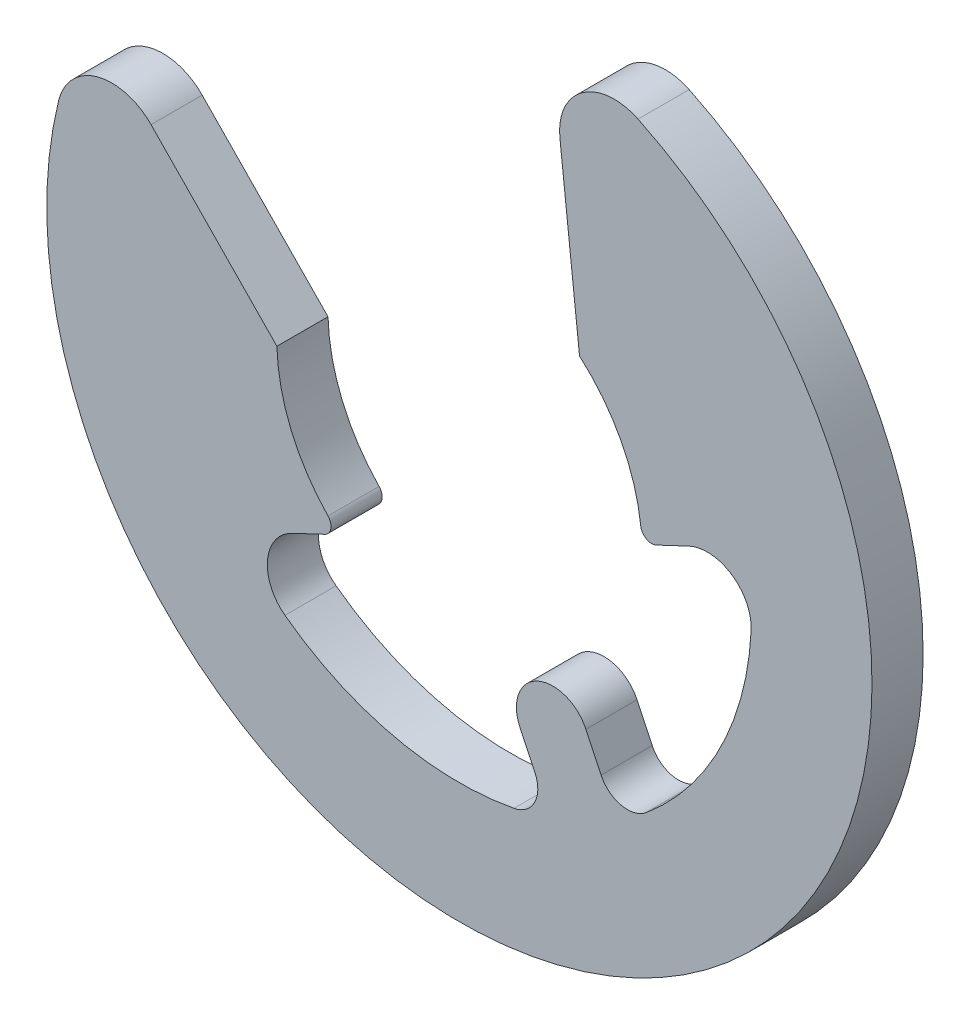
ISO-10303-21;
HEADER;
FILE_DESCRIPTION(('STEP AP214'),'2;1');
FILE_NAME('part.step','',(''),(''),'','','');
FILE_SCHEMA(('AUTOMOTIVE_DESIGN { 1 0 10303 214 1 1 1 1 }'));
ENDSEC;
DATA;
#1=APPLICATION_CONTEXT('core data for automotive mechanical design processes');
#2=APPLICATION_PROTOCOL_DEFINITION('international standard','automotive_design',2000,#1);
#3=PRODUCT_CONTEXT('',#1,'mechanical');
#4=PRODUCT('Part','Part','',(#3));
#5=PRODUCT_RELATED_PRODUCT_CATEGORY('part','',(#4));
#6=PRODUCT_DEFINITION_FORMATION('','',#4);
#7=PRODUCT_DEFINITION_CONTEXT('part definition',#1,'design');
#8=PRODUCT_DEFINITION('design','',#6,#7);
#9=PRODUCT_DEFINITION_SHAPE('','',#8);
#10=(LENGTH_UNIT() NAMED_UNIT(*) SI_UNIT(.MILLI.,.METRE.));
#11=(NAMED_UNIT(*) PLANE_ANGLE_UNIT() SI_UNIT($,.RADIAN.));
#12=(NAMED_UNIT(*) SI_UNIT($,.STERADIAN.) SOLID_ANGLE_UNIT());
#13=UNCERTAINTY_MEASURE_WITH_UNIT(LENGTH_MEASURE(1.E-05),#10,'distance_accuracy_value','');
#14=(GEOMETRIC_REPRESENTATION_CONTEXT(3) GLOBAL_UNCERTAINTY_ASSIGNED_CONTEXT((#13)) GLOBAL_UNIT_ASSIGNED_CONTEXT((#10,
#11,#12)) REPRESENTATION_CONTEXT('',''));
#15=CARTESIAN_POINT('',(0.,0.,0.));
#16=DIRECTION('',(0.,0.,1.));
#17=DIRECTION('',(1.,0.,0.));
#18=AXIS2_PLACEMENT_3D('',#15,#16,#17);
#19=CARTESIAN_POINT('',(0.512266617917888,5.9146422259787,-18.3));
#20=DIRECTION('',(0.,0.,1.));
#21=DIRECTION('',(0.,-1.,0.));
#22=AXIS2_PLACEMENT_3D('',#19,#20,#21);
#23=PLANE('',#22);
#24=CARTESIAN_POINT('',(0.,7.,-18.3));
#25=DIRECTION('',(0.,0.,1.));
#26=DIRECTION('',(1.,0.,0.));
#27=AXIS2_PLACEMENT_3D('',#24,#25,#26);
#28=CIRCLE('',#27,2.5);
#29=CARTESIAN_POINT('',(-1.7991094183781,5.26414133619606,-18.3));
#30=VERTEX_POINT('',#29);
#31=CARTESIAN_POINT('',(-2.49891490841319,6.92635028506309,-18.3));
#32=VERTEX_POINT('',#31);
#33=EDGE_CURVE('E175',#30,#32,#28,.F.);
#34=ORIENTED_EDGE('',*,*,#33,.T.);
#35=DIRECTION('',(-0.698140103515913,0.715961169242292,0.));
#36=VECTOR('',#35,1.);
#37=CARTESIAN_POINT('',(-4.22147382335914,8.69288008133531,-18.3));
#38=LINE('',#37,#36);
#39=CARTESIAN_POINT('',(-4.22147382335914,8.69288008133531,-18.3));
#40=VERTEX_POINT('',#39);
#41=EDGE_CURVE('E156',#40,#32,#38,.F.);
#42=ORIENTED_EDGE('',*,*,#41,.F.);
#43=CARTESIAN_POINT('',(-4.75844470029086,8.16927500369837,-18.3));
#44=DIRECTION('',(0.,0.,1.));
#45=DIRECTION('',(1.,0.,0.));
#46=AXIS2_PLACEMENT_3D('',#43,#44,#45);
#47=CIRCLE('',#46,0.750000000000001);
#48=CARTESIAN_POINT('',(-5.48677807278436,8.34824566752975,-18.3));
#49=VERTEX_POINT('',#48);
#50=EDGE_CURVE('E19',#40,#49,#47,.T.);
#51=ORIENTED_EDGE('',*,*,#50,.T.);
#52=CARTESIAN_POINT('',(0.,7.,-18.3));
#53=DIRECTION('',(0.,0.,1.));
#54=DIRECTION('',(1.,0.,0.));
#55=AXIS2_PLACEMENT_3D('',#52,#53,#54);
#56=CIRCLE('',#55,5.65);
#57=CARTESIAN_POINT('',(2.44677442311725,12.0927197961776,-18.3));
#58=VERTEX_POINT('',#57);
#59=EDGE_CURVE('E154',#58,#49,#56,.F.);
#60=ORIENTED_EDGE('',*,*,#59,.F.);
#61=CARTESIAN_POINT('',(2.12198135810169,11.4166950444726,-18.3));
#62=DIRECTION('',(0.,0.,1.));
#63=DIRECTION('',(1.,0.,0.));
#64=AXIS2_PLACEMENT_3D('',#61,#62,#63);
#65=CIRCLE('',#64,0.750000000000001);
#66=CARTESIAN_POINT('',(1.37644584133832,11.3349833975404,-18.3));
#67=VERTEX_POINT('',#66);
#68=EDGE_CURVE('E163',#67,#58,#65,.F.);
#69=ORIENTED_EDGE('',*,*,#68,.F.);
#70=DIRECTION('',(0.108948862576308,-0.994047355684491,0.));
#71=VECTOR('',#70,1.);
#72=CARTESIAN_POINT('',(1.64526127474332,8.88231648184624,-18.3));
#73=LINE('',#72,#71);
#74=CARTESIAN_POINT('',(1.64526127474332,8.88231648184623,-18.3));
#75=VERTEX_POINT('',#74);
#76=EDGE_CURVE('E227',#75,#67,#73,.F.);
#77=ORIENTED_EDGE('',*,*,#76,.F.);
#78=CARTESIAN_POINT('',(0.,7.,-18.3));
#79=DIRECTION('',(0.,0.,1.));
#80=DIRECTION('',(1.,0.,0.));
#81=AXIS2_PLACEMENT_3D('',#78,#79,#80);
#82=CIRCLE('',#81,2.5);
#83=CARTESIAN_POINT('',(2.48364299254734,7.285512671471,-18.3));
#84=VERTEX_POINT('',#83);
#85=EDGE_CURVE('E224',#75,#84,#82,.F.);
#86=ORIENTED_EDGE('',*,*,#85,.T.);
#87=CARTESIAN_POINT('',(2.63266157210018,7.30264343175926,-18.3));
#88=DIRECTION('',(0.,0.,1.));
#89=DIRECTION('',(1.,0.,0.));
#90=AXIS2_PLACEMENT_3D('',#87,#88,#89);
#91=CIRCLE('',#90,0.15);
#92=CARTESIAN_POINT('',(2.69668559462542,7.16699342424106,-18.3));
#93=VERTEX_POINT('',#92);
#94=EDGE_CURVE('E220',#93,#84,#91,.F.);
#95=ORIENTED_EDGE('',*,*,#94,.F.);
#96=DIRECTION('',(0.904333383454662,0.426826816834936,0.));
#97=VECTOR('',#96,1.);
#98=CARTESIAN_POINT('',(3.13982696719892,7.37614706705015,-18.3));
#99=LINE('',#98,#97);
#100=CARTESIAN_POINT('',(3.13982696719892,7.37614706705015,-18.3));
#101=VERTEX_POINT('',#100);
#102=EDGE_CURVE('E217',#101,#93,#99,.F.);
#103=ORIENTED_EDGE('',*,*,#102,.F.);
#104=CARTESIAN_POINT('',(3.39592305729988,6.83354703697735,-18.3));
#105=DIRECTION('',(0.,0.,1.));
#106=DIRECTION('',(1.,0.,0.));
#107=AXIS2_PLACEMENT_3D('',#104,#105,#106);
#108=CIRCLE('',#107,0.6);
#109=CARTESIAN_POINT('',(3.99520359682339,6.80417298467924,-18.3));
#110=VERTEX_POINT('',#109);
#111=EDGE_CURVE('E214',#101,#110,#108,.F.);
#112=ORIENTED_EDGE('',*,*,#111,.T.);
#113=CARTESIAN_POINT('',(0.,7.,-18.3));
#114=DIRECTION('',(0.,0.,1.));
#115=DIRECTION('',(1.,0.,0.));
#116=AXIS2_PLACEMENT_3D('',#113,#114,#115);
#117=CIRCLE('',#116,4.);
#118=CARTESIAN_POINT('',(2.55742653677109,3.92435868329562,-18.3));
#119=VERTEX_POINT('',#118);
#120=EDGE_CURVE('E210',#110,#119,#117,.F.);
#121=ORIENTED_EDGE('',*,*,#120,.T.);
#122=CARTESIAN_POINT('',(2.30168388309398,4.23192281496606,-18.3));
#123=DIRECTION('',(0.,0.,1.));
#124=DIRECTION('',(1.,0.,0.));
#125=AXIS2_PLACEMENT_3D('',#122,#123,#124);
#126=CIRCLE('',#125,0.4);
#127=CARTESIAN_POINT('',(1.93995052971212,4.06119208823209,-18.3));
#128=VERTEX_POINT('',#127);
#129=EDGE_CURVE('E206',#119,#128,#126,.F.);
#130=ORIENTED_EDGE('',*,*,#129,.T.);
#131=DIRECTION('',(-0.426826816834936,0.904333383454662,0.));
#132=VECTOR('',#131,1.);
#133=CARTESIAN_POINT('',(1.73264714223214,4.50041325805348,-18.3));
#134=LINE('',#133,#132);
#135=CARTESIAN_POINT('',(1.73264714223214,4.50041325805349,-18.3));
#136=VERTEX_POINT('',#135);
#137=EDGE_CURVE('E202',#136,#128,#134,.F.);
#138=ORIENTED_EDGE('',*,*,#137,.F.);
#139=CARTESIAN_POINT('',(1.28048045050481,4.28699984963602,-18.3));
#140=DIRECTION('',(0.,0.,1.));
#141=DIRECTION('',(1.,0.,0.));
#142=AXIS2_PLACEMENT_3D('',#139,#140,#141);
#143=CIRCLE('',#142,0.5);
#144=CARTESIAN_POINT('',(0.828313758777477,4.07358644121855,-18.3));
#145=VERTEX_POINT('',#144);
#146=EDGE_CURVE('E199',#145,#136,#143,.F.);
#147=ORIENTED_EDGE('',*,*,#146,.F.);
#148=DIRECTION('',(0.426826816834936,-0.904333383454662,0.));
#149=VECTOR('',#148,1.);
#150=CARTESIAN_POINT('',(1.03561714625746,3.63436527139715,-18.3));
#151=LINE('',#150,#149);
#152=CARTESIAN_POINT('',(1.03561714625746,3.63436527139715,-18.3));
#153=VERTEX_POINT('',#152);
#154=EDGE_CURVE('E196',#153,#145,#151,.F.);
#155=ORIENTED_EDGE('',*,*,#154,.F.);
#156=CARTESIAN_POINT('',(0.673883792875592,3.46363454466318,-18.3));
#157=DIRECTION('',(0.,0.,1.));
#158=DIRECTION('',(1.,0.,0.));
#159=AXIS2_PLACEMENT_3D('',#156,#157,#158);
#160=CIRCLE('',#159,0.4);
#161=CARTESIAN_POINT('',(0.748759769861767,3.07070504962575,-18.3));
#162=VERTEX_POINT('',#161);
#163=EDGE_CURVE('E193',#153,#162,#160,.F.);
#164=ORIENTED_EDGE('',*,*,#163,.T.);
#165=CARTESIAN_POINT('',(0.,7.,-18.3));
#166=DIRECTION('',(0.,0.,1.));
#167=DIRECTION('',(1.,0.,0.));
#168=AXIS2_PLACEMENT_3D('',#165,#166,#167);
#169=CIRCLE('',#168,4.);
#170=CARTESIAN_POINT('',(-2.38832616873893,3.79127780702086,-18.3));
#171=VERTEX_POINT('',#170);
#172=EDGE_CURVE('E189',#162,#171,#169,.F.);
#173=ORIENTED_EDGE('',*,*,#172,.T.);
#174=CARTESIAN_POINT('',(-2.03007724342809,4.27258613596773,-18.3));
#175=DIRECTION('',(0.,0.,1.));
#176=DIRECTION('',(1.,0.,0.));
#177=AXIS2_PLACEMENT_3D('',#174,#175,#176);
#178=CIRCLE('',#177,0.6);
#179=CARTESIAN_POINT('',(-2.28617333352905,4.81518616604053,-18.3));
#180=VERTEX_POINT('',#179);
#181=EDGE_CURVE('E185',#171,#180,#178,.F.);
#182=ORIENTED_EDGE('',*,*,#181,.T.);
#183=DIRECTION('',(0.904333383454662,0.426826816834936,0.));
#184=VECTOR('',#183,1.);
#185=CARTESIAN_POINT('',(-1.84303196095555,5.02433980884962,-18.3));
#186=LINE('',#185,#184);
#187=CARTESIAN_POINT('',(-1.84303196095555,5.02433980884962,-18.3));
#188=VERTEX_POINT('',#187);
#189=EDGE_CURVE('E181',#188,#180,#186,.F.);
#190=ORIENTED_EDGE('',*,*,#189,.F.);
#191=CARTESIAN_POINT('',(-1.90705598348079,5.15998981636782,-18.3));
#192=DIRECTION('',(0.,0.,1.));
#193=DIRECTION('',(1.,0.,0.));
#194=AXIS2_PLACEMENT_3D('',#191,#192,#193);
#195=CIRCLE('',#194,0.15);
#196=EDGE_CURVE('E178',#30,#188,#195,.F.);
#197=ORIENTED_EDGE('',*,*,#196,.F.);
#198=EDGE_LOOP('',(#34,#42,#51,#60,#69,#77,#86,#95,#103,#112,#121,#130,#138,#147,#155,#164,#173,
#182,#190,#197));
#199=FACE_BOUND('',#198,.T.);
#200=ADVANCED_FACE('F16',(#199),#23,.T.);
#201=CARTESIAN_POINT('',(0.,7.,-19.));
#202=DIRECTION('',(0.,0.,1.));
#203=DIRECTION('',(1.,0.,0.));
#204=AXIS2_PLACEMENT_3D('',#201,#202,#203);
#205=CYLINDRICAL_SURFACE('',#204,5.65);
#206=DIRECTION('',(0.,0.,1.));
#207=VECTOR('',#206,1.);
#208=CARTESIAN_POINT('',(2.44677442311725,12.0927197961776,-19.));
#209=LINE('',#208,#207);
#210=CARTESIAN_POINT('',(2.44677442311725,12.0927197961776,-19.));
#211=VERTEX_POINT('',#210);
#212=EDGE_CURVE('E162',#58,#211,#209,.F.);
#213=ORIENTED_EDGE('',*,*,#212,.F.);
#214=ORIENTED_EDGE('',*,*,#59,.T.);
#215=DIRECTION('',(0.,0.,1.));
#216=VECTOR('',#215,1.);
#217=CARTESIAN_POINT('',(-5.48677807278436,8.34824566752976,-19.));
#218=LINE('',#217,#216);
#219=CARTESIAN_POINT('',(-5.48677807278436,8.34824566752975,-19.));
#220=VERTEX_POINT('',#219);
#221=EDGE_CURVE('E161',#220,#49,#218,.T.);
#222=ORIENTED_EDGE('',*,*,#221,.F.);
#223=CARTESIAN_POINT('',(0.,7.,-19.));
#224=DIRECTION('',(0.,0.,1.));
#225=DIRECTION('',(1.,0.,0.));
#226=AXIS2_PLACEMENT_3D('',#223,#224,#225);
#227=CIRCLE('',#226,5.65);
#228=EDGE_CURVE('E167',#220,#211,#227,.T.);
#229=ORIENTED_EDGE('',*,*,#228,.T.);
#230=EDGE_LOOP('',(#213,#214,#222,#229));
#231=FACE_BOUND('',#230,.T.);
#232=ADVANCED_FACE('F159',(#231),#205,.T.);
#233=CARTESIAN_POINT('',(2.12198135810169,11.4166950444726,-19.));
#234=DIRECTION('',(0.,0.,1.));
#235=DIRECTION('',(1.,0.,0.));
#236=AXIS2_PLACEMENT_3D('',#233,#234,#235);
#237=CYLINDRICAL_SURFACE('',#236,0.750000000000001);
#238=ORIENTED_EDGE('',*,*,#68,.T.);
#239=ORIENTED_EDGE('',*,*,#212,.T.);
#240=CARTESIAN_POINT('',(2.12198135810169,11.4166950444726,-19.));
#241=DIRECTION('',(0.,0.,1.));
#242=DIRECTION('',(1.,0.,0.));
#243=AXIS2_PLACEMENT_3D('',#240,#241,#242);
#244=CIRCLE('',#243,0.750000000000001);
#245=CARTESIAN_POINT('',(1.37644584133832,11.3349833975404,-19.));
#246=VERTEX_POINT('',#245);
#247=EDGE_CURVE('E273',#211,#246,#244,.T.);
#248=ORIENTED_EDGE('',*,*,#247,.T.);
#249=DIRECTION('',(0.,0.,1.));
#250=VECTOR('',#249,1.);
#251=CARTESIAN_POINT('',(1.37644584133832,11.3349833975404,-19.));
#252=LINE('',#251,#250);
#253=EDGE_CURVE('E225',#67,#246,#252,.F.);
#254=ORIENTED_EDGE('',*,*,#253,.F.);
#255=EDGE_LOOP('',(#238,#239,#248,#254));
#256=FACE_BOUND('',#255,.T.);
#257=ADVANCED_FACE('F297',(#256),#237,.T.);
#258=CARTESIAN_POINT('',(1.64526127474332,8.88231648184624,-19.));
#259=DIRECTION('',(-0.994047355684491,-0.108948862576308,0.));
#260=DIRECTION('',(0.108948862576308,-0.994047355684491,0.));
#261=AXIS2_PLACEMENT_3D('',#258,#259,#260);
#262=PLANE('',#261);
#263=ORIENTED_EDGE('',*,*,#76,.T.);
#264=ORIENTED_EDGE('',*,*,#253,.T.);
#265=DIRECTION('',(0.108948862576307,-0.994047355684491,0.));
#266=VECTOR('',#265,1.);
#267=CARTESIAN_POINT('',(1.37644584133832,11.3349833975404,-19.));
#268=LINE('',#267,#266);
#269=CARTESIAN_POINT('',(1.64526127474332,8.88231648184624,-19.));
#270=VERTEX_POINT('',#269);
#271=EDGE_CURVE('E272',#246,#270,#268,.T.);
#272=ORIENTED_EDGE('',*,*,#271,.T.);
#273=DIRECTION('',(0.,0.,1.));
#274=VECTOR('',#273,1.);
#275=CARTESIAN_POINT('',(1.64526127474332,8.88231648184624,-19.));
#276=LINE('',#275,#274);
#277=EDGE_CURVE('E221',#270,#75,#276,.T.);
#278=ORIENTED_EDGE('',*,*,#277,.T.);
#279=EDGE_LOOP('',(#263,#264,#272,#278));
#280=FACE_BOUND('',#279,.T.);
#281=ADVANCED_FACE('F304',(#280),#262,.T.);
#282=CARTESIAN_POINT('',(0.,7.,-19.));
#283=DIRECTION('',(0.,0.,1.));
#284=DIRECTION('',(1.,0.,0.));
#285=AXIS2_PLACEMENT_3D('',#282,#283,#284);
#286=CYLINDRICAL_SURFACE('',#285,2.5);
#287=CARTESIAN_POINT('',(0.,7.,-19.));
#288=DIRECTION('',(0.,0.,1.));
#289=DIRECTION('',(1.,0.,0.));
#290=AXIS2_PLACEMENT_3D('',#287,#288,#289);
#291=CIRCLE('',#290,2.5);
#292=CARTESIAN_POINT('',(2.48364299254734,7.285512671471,-19.));
#293=VERTEX_POINT('',#292);
#294=EDGE_CURVE('E269',#270,#293,#291,.F.);
#295=ORIENTED_EDGE('',*,*,#294,.T.);
#296=DIRECTION('',(0.,0.,1.));
#297=VECTOR('',#296,1.);
#298=CARTESIAN_POINT('',(2.48364299254734,7.285512671471,-19.));
#299=LINE('',#298,#297);
#300=EDGE_CURVE('E218',#84,#293,#299,.F.);
#301=ORIENTED_EDGE('',*,*,#300,.F.);
#302=ORIENTED_EDGE('',*,*,#85,.F.);
#303=ORIENTED_EDGE('',*,*,#277,.F.);
#304=EDGE_LOOP('',(#295,#301,#302,#303));
#305=FACE_BOUND('',#304,.T.);
#306=ADVANCED_FACE('F308',(#305),#286,.F.);
#307=CARTESIAN_POINT('',(2.63266157210018,7.30264343175926,-19.));
#308=DIRECTION('',(0.,0.,1.));
#309=DIRECTION('',(1.,0.,0.));
#310=AXIS2_PLACEMENT_3D('',#307,#308,#309);
#311=CYLINDRICAL_SURFACE('',#310,0.15);
#312=ORIENTED_EDGE('',*,*,#94,.T.);
#313=ORIENTED_EDGE('',*,*,#300,.T.);
#314=CARTESIAN_POINT('',(2.63266157210018,7.30264343175926,-19.));
#315=DIRECTION('',(0.,0.,1.));
#316=DIRECTION('',(1.,0.,0.));
#317=AXIS2_PLACEMENT_3D('',#314,#315,#316);
#318=CIRCLE('',#317,0.15);
#319=CARTESIAN_POINT('',(2.69668559462542,7.16699342424106,-19.));
#320=VERTEX_POINT('',#319);
#321=EDGE_CURVE('E266',#293,#320,#318,.T.);
#322=ORIENTED_EDGE('',*,*,#321,.T.);
#323=DIRECTION('',(0.,0.,1.));
#324=VECTOR('',#323,1.);
#325=CARTESIAN_POINT('',(2.69668559462542,7.16699342424106,-19.));
#326=LINE('',#325,#324);
#327=EDGE_CURVE('E215',#93,#320,#326,.F.);
#328=ORIENTED_EDGE('',*,*,#327,.F.);
#329=EDGE_LOOP('',(#312,#313,#322,#328));
#330=FACE_BOUND('',#329,.T.);
#331=ADVANCED_FACE('F318',(#330),#311,.T.);
#332=CARTESIAN_POINT('',(3.13982696719892,7.37614706705015,-19.));
#333=DIRECTION('',(0.426826816834936,-0.904333383454662,0.));
#334=DIRECTION('',(0.904333383454662,0.426826816834936,0.));
#335=AXIS2_PLACEMENT_3D('',#332,#333,#334);
#336=PLANE('',#335);
#337=ORIENTED_EDGE('',*,*,#102,.T.);
#338=ORIENTED_EDGE('',*,*,#327,.T.);
#339=DIRECTION('',(0.904333383454664,0.426826816834932,0.));
#340=VECTOR('',#339,1.);
#341=CARTESIAN_POINT('',(2.69668559462542,7.16699342424106,-19.));
#342=LINE('',#341,#340);
#343=CARTESIAN_POINT('',(3.13982696719892,7.37614706705015,-19.));
#344=VERTEX_POINT('',#343);
#345=EDGE_CURVE('E265',#320,#344,#342,.T.);
#346=ORIENTED_EDGE('',*,*,#345,.T.);
#347=DIRECTION('',(0.,0.,1.));
#348=VECTOR('',#347,1.);
#349=CARTESIAN_POINT('',(3.13982696719892,7.37614706705015,-19.));
#350=LINE('',#349,#348);
#351=EDGE_CURVE('E211',#344,#101,#350,.T.);
#352=ORIENTED_EDGE('',*,*,#351,.T.);
#353=EDGE_LOOP('',(#337,#338,#346,#352));
#354=FACE_BOUND('',#353,.T.);
#355=ADVANCED_FACE('F321',(#354),#336,.T.);
#356=CARTESIAN_POINT('',(3.39592305729988,6.83354703697735,-19.));
#357=DIRECTION('',(0.,0.,1.));
#358=DIRECTION('',(1.,0.,0.));
#359=AXIS2_PLACEMENT_3D('',#356,#357,#358);
#360=CYLINDRICAL_SURFACE('',#359,0.6);
#361=CARTESIAN_POINT('',(3.39592305729988,6.83354703697735,-19.));
#362=DIRECTION('',(0.,0.,1.));
#363=DIRECTION('',(1.,0.,0.));
#364=AXIS2_PLACEMENT_3D('',#361,#362,#363);
#365=CIRCLE('',#364,0.6);
#366=CARTESIAN_POINT('',(3.99520359682339,6.80417298467924,-19.));
#367=VERTEX_POINT('',#366);
#368=EDGE_CURVE('E262',#344,#367,#365,.F.);
#369=ORIENTED_EDGE('',*,*,#368,.T.);
#370=DIRECTION('',(0.,0.,1.));
#371=VECTOR('',#370,1.);
#372=CARTESIAN_POINT('',(3.99520359682339,6.80417298467924,-19.));
#373=LINE('',#372,#371);
#374=EDGE_CURVE('E207',#367,#110,#373,.T.);
#375=ORIENTED_EDGE('',*,*,#374,.T.);
#376=ORIENTED_EDGE('',*,*,#111,.F.);
#377=ORIENTED_EDGE('',*,*,#351,.F.);
#378=EDGE_LOOP('',(#369,#375,#376,#377));
#379=FACE_BOUND('',#378,.T.);
#380=ADVANCED_FACE('F323',(#379),#360,.F.);
#381=CARTESIAN_POINT('',(0.,7.,-19.));
#382=DIRECTION('',(0.,0.,1.));
#383=DIRECTION('',(1.,0.,0.));
#384=AXIS2_PLACEMENT_3D('',#381,#382,#383);
#385=CYLINDRICAL_SURFACE('',#384,4.);
#386=CARTESIAN_POINT('',(0.,7.,-19.));
#387=DIRECTION('',(0.,0.,1.));
#388=DIRECTION('',(1.,0.,0.));
#389=AXIS2_PLACEMENT_3D('',#386,#387,#388);
#390=CIRCLE('',#389,4.);
#391=CARTESIAN_POINT('',(2.55742653677109,3.92435868329562,-19.));
#392=VERTEX_POINT('',#391);
#393=EDGE_CURVE('E259',#367,#392,#390,.F.);
#394=ORIENTED_EDGE('',*,*,#393,.T.);
#395=DIRECTION('',(0.,0.,1.));
#396=VECTOR('',#395,1.);
#397=CARTESIAN_POINT('',(2.55742653677109,3.92435868329562,-19.));
#398=LINE('',#397,#396);
#399=EDGE_CURVE('E203',#392,#119,#398,.T.);
#400=ORIENTED_EDGE('',*,*,#399,.T.);
#401=ORIENTED_EDGE('',*,*,#120,.F.);
#402=ORIENTED_EDGE('',*,*,#374,.F.);
#403=EDGE_LOOP('',(#394,#400,#401,#402));
#404=FACE_BOUND('',#403,.T.);
#405=ADVANCED_FACE('F328',(#404),#385,.F.);
#406=CARTESIAN_POINT('',(2.30168388309398,4.23192281496606,-19.));
#407=DIRECTION('',(0.,0.,1.));
#408=DIRECTION('',(1.,0.,0.));
#409=AXIS2_PLACEMENT_3D('',#406,#407,#408);
#410=CYLINDRICAL_SURFACE('',#409,0.4);
#411=CARTESIAN_POINT('',(2.30168388309398,4.23192281496606,-19.));
#412=DIRECTION('',(0.,0.,1.));
#413=DIRECTION('',(1.,0.,0.));
#414=AXIS2_PLACEMENT_3D('',#411,#412,#413);
#415=CIRCLE('',#414,0.4);
#416=CARTESIAN_POINT('',(1.93995052971212,4.06119208823209,-19.));
#417=VERTEX_POINT('',#416);
#418=EDGE_CURVE('E256',#392,#417,#415,.F.);
#419=ORIENTED_EDGE('',*,*,#418,.T.);
#420=DIRECTION('',(0.,0.,1.));
#421=VECTOR('',#420,1.);
#422=CARTESIAN_POINT('',(1.93995052971212,4.06119208823209,-19.));
#423=LINE('',#422,#421);
#424=EDGE_CURVE('E200',#128,#417,#423,.F.);
#425=ORIENTED_EDGE('',*,*,#424,.F.);
#426=ORIENTED_EDGE('',*,*,#129,.F.);
#427=ORIENTED_EDGE('',*,*,#399,.F.);
#428=EDGE_LOOP('',(#419,#425,#426,#427));
#429=FACE_BOUND('',#428,.T.);
#430=ADVANCED_FACE('F334',(#429),#410,.F.);
#431=CARTESIAN_POINT('',(1.73264714223214,4.50041325805348,-19.));
#432=DIRECTION('',(0.904333383454662,0.426826816834936,0.));
#433=DIRECTION('',(-0.426826816834936,0.904333383454662,0.));
#434=AXIS2_PLACEMENT_3D('',#431,#432,#433);
#435=PLANE('',#434);
#436=ORIENTED_EDGE('',*,*,#137,.T.);
#437=ORIENTED_EDGE('',*,*,#424,.T.);
#438=DIRECTION('',(-0.426826816834935,0.904333383454662,0.));
#439=VECTOR('',#438,1.);
#440=CARTESIAN_POINT('',(1.93995052971212,4.06119208823209,-19.));
#441=LINE('',#440,#439);
#442=CARTESIAN_POINT('',(1.73264714223214,4.50041325805349,-19.));
#443=VERTEX_POINT('',#442);
#444=EDGE_CURVE('E255',#417,#443,#441,.T.);
#445=ORIENTED_EDGE('',*,*,#444,.T.);
#446=DIRECTION('',(0.,0.,1.));
#447=VECTOR('',#446,1.);
#448=CARTESIAN_POINT('',(1.73264714223214,4.50041325805349,-19.));
#449=LINE('',#448,#447);
#450=EDGE_CURVE('E197',#136,#443,#449,.F.);
#451=ORIENTED_EDGE('',*,*,#450,.F.);
#452=EDGE_LOOP('',(#436,#437,#445,#451));
#453=FACE_BOUND('',#452,.T.);
#454=ADVANCED_FACE('F337',(#453),#435,.T.);
#455=CARTESIAN_POINT('',(1.28048045050481,4.28699984963602,-19.));
#456=DIRECTION('',(0.,0.,1.));
#457=DIRECTION('',(1.,0.,0.));
#458=AXIS2_PLACEMENT_3D('',#455,#456,#457);
#459=CYLINDRICAL_SURFACE('',#458,0.5);
#460=ORIENTED_EDGE('',*,*,#146,.T.);
#461=ORIENTED_EDGE('',*,*,#450,.T.);
#462=CARTESIAN_POINT('',(1.28048045050481,4.28699984963602,-19.));
#463=DIRECTION('',(0.,0.,1.));
#464=DIRECTION('',(1.,0.,0.));
#465=AXIS2_PLACEMENT_3D('',#462,#463,#464);
#466=CIRCLE('',#465,0.5);
#467=CARTESIAN_POINT('',(0.828313758777477,4.07358644121855,-19.));
#468=VERTEX_POINT('',#467);
#469=EDGE_CURVE('E252',#443,#468,#466,.T.);
#470=ORIENTED_EDGE('',*,*,#469,.T.);
#471=DIRECTION('',(0.,0.,1.));
#472=VECTOR('',#471,1.);
#473=CARTESIAN_POINT('',(0.828313758777477,4.07358644121855,-19.));
#474=LINE('',#473,#472);
#475=EDGE_CURVE('E194',#145,#468,#474,.F.);
#476=ORIENTED_EDGE('',*,*,#475,.F.);
#477=EDGE_LOOP('',(#460,#461,#470,#476));
#478=FACE_BOUND('',#477,.T.);
#479=ADVANCED_FACE('F378',(#478),#459,.T.);
#480=CARTESIAN_POINT('',(1.03561714625746,3.63436527139715,-19.));
#481=DIRECTION('',(-0.904333383454662,-0.426826816834936,0.));
#482=DIRECTION('',(0.426826816834936,-0.904333383454662,0.));
#483=AXIS2_PLACEMENT_3D('',#480,#481,#482);
#484=PLANE('',#483);
#485=ORIENTED_EDGE('',*,*,#154,.T.);
#486=ORIENTED_EDGE('',*,*,#475,.T.);
#487=DIRECTION('',(0.426826816834936,-0.904333383454661,0.));
#488=VECTOR('',#487,1.);
#489=CARTESIAN_POINT('',(0.828313758777477,4.07358644121855,-19.));
#490=LINE('',#489,#488);
#491=CARTESIAN_POINT('',(1.03561714625746,3.63436527139715,-19.));
#492=VERTEX_POINT('',#491);
#493=EDGE_CURVE('E251',#468,#492,#490,.T.);
#494=ORIENTED_EDGE('',*,*,#493,.T.);
#495=DIRECTION('',(0.,0.,1.));
#496=VECTOR('',#495,1.);
#497=CARTESIAN_POINT('',(1.03561714625746,3.63436527139715,-19.));
#498=LINE('',#497,#496);
#499=EDGE_CURVE('E190',#492,#153,#498,.T.);
#500=ORIENTED_EDGE('',*,*,#499,.T.);
#501=EDGE_LOOP('',(#485,#486,#494,#500));
#502=FACE_BOUND('',#501,.T.);
#503=ADVANCED_FACE('F375',(#502),#484,.T.);
#504=CARTESIAN_POINT('',(0.673883792875592,3.46363454466318,-19.));
#505=DIRECTION('',(0.,0.,1.));
#506=DIRECTION('',(1.,0.,0.));
#507=AXIS2_PLACEMENT_3D('',#504,#505,#506);
#508=CYLINDRICAL_SURFACE('',#507,0.4);
#509=CARTESIAN_POINT('',(0.673883792875592,3.46363454466318,-19.));
#510=DIRECTION('',(0.,0.,1.));
#511=DIRECTION('',(1.,0.,0.));
#512=AXIS2_PLACEMENT_3D('',#509,#510,#511);
#513=CIRCLE('',#512,0.4);
#514=CARTESIAN_POINT('',(0.748759769861767,3.07070504962575,-19.));
#515=VERTEX_POINT('',#514);
#516=EDGE_CURVE('E248',#492,#515,#513,.F.);
#517=ORIENTED_EDGE('',*,*,#516,.T.);
#518=DIRECTION('',(0.,0.,1.));
#519=VECTOR('',#518,1.);
#520=CARTESIAN_POINT('',(0.748759769861766,3.07070504962575,-19.));
#521=LINE('',#520,#519);
#522=EDGE_CURVE('E186',#515,#162,#521,.T.);
#523=ORIENTED_EDGE('',*,*,#522,.T.);
#524=ORIENTED_EDGE('',*,*,#163,.F.);
#525=ORIENTED_EDGE('',*,*,#499,.F.);
#526=EDGE_LOOP('',(#517,#523,#524,#525));
#527=FACE_BOUND('',#526,.T.);
#528=ADVANCED_FACE('F372',(#527),#508,.F.);
#529=CARTESIAN_POINT('',(0.,7.,-19.));
#530=DIRECTION('',(0.,0.,1.));
#531=DIRECTION('',(1.,0.,0.));
#532=AXIS2_PLACEMENT_3D('',#529,#530,#531);
#533=CYLINDRICAL_SURFACE('',#532,4.);
#534=CARTESIAN_POINT('',(0.,7.,-19.));
#535=DIRECTION('',(0.,0.,1.));
#536=DIRECTION('',(1.,0.,0.));
#537=AXIS2_PLACEMENT_3D('',#534,#535,#536);
#538=CIRCLE('',#537,4.);
#539=CARTESIAN_POINT('',(-2.38832616873893,3.79127780702086,-19.));
#540=VERTEX_POINT('',#539);
#541=EDGE_CURVE('E245',#515,#540,#538,.F.);
#542=ORIENTED_EDGE('',*,*,#541,.T.);
#543=DIRECTION('',(0.,0.,1.));
#544=VECTOR('',#543,1.);
#545=CARTESIAN_POINT('',(-2.38832616873893,3.79127780702086,-19.));
#546=LINE('',#545,#544);
#547=EDGE_CURVE('E182',#540,#171,#546,.T.);
#548=ORIENTED_EDGE('',*,*,#547,.T.);
#549=ORIENTED_EDGE('',*,*,#172,.F.);
#550=ORIENTED_EDGE('',*,*,#522,.F.);
#551=EDGE_LOOP('',(#542,#548,#549,#550));
#552=FACE_BOUND('',#551,.T.);
#553=ADVANCED_FACE('F370',(#552),#533,.F.);
#554=CARTESIAN_POINT('',(-2.03007724342809,4.27258613596773,-19.));
#555=DIRECTION('',(0.,0.,1.));
#556=DIRECTION('',(1.,0.,0.));
#557=AXIS2_PLACEMENT_3D('',#554,#555,#556);
#558=CYLINDRICAL_SURFACE('',#557,0.6);
#559=CARTESIAN_POINT('',(-2.03007724342809,4.27258613596773,-19.));
#560=DIRECTION('',(0.,0.,1.));
#561=DIRECTION('',(1.,0.,0.));
#562=AXIS2_PLACEMENT_3D('',#559,#560,#561);
#563=CIRCLE('',#562,0.6);
#564=CARTESIAN_POINT('',(-2.28617333352905,4.81518616604053,-19.));
#565=VERTEX_POINT('',#564);
#566=EDGE_CURVE('E242',#540,#565,#563,.F.);
#567=ORIENTED_EDGE('',*,*,#566,.T.);
#568=DIRECTION('',(0.,0.,1.));
#569=VECTOR('',#568,1.);
#570=CARTESIAN_POINT('',(-2.28617333352905,4.81518616604053,-19.));
#571=LINE('',#570,#569);
#572=EDGE_CURVE('E179',#180,#565,#571,.F.);
#573=ORIENTED_EDGE('',*,*,#572,.F.);
#574=ORIENTED_EDGE('',*,*,#181,.F.);
#575=ORIENTED_EDGE('',*,*,#547,.F.);
#576=EDGE_LOOP('',(#567,#573,#574,#575));
#577=FACE_BOUND('',#576,.T.);
#578=ADVANCED_FACE('F366',(#577),#558,.F.);
#579=CARTESIAN_POINT('',(-1.84303196095555,5.02433980884962,-19.));
#580=DIRECTION('',(0.426826816834936,-0.904333383454662,0.));
#581=DIRECTION('',(0.904333383454662,0.426826816834936,0.));
#582=AXIS2_PLACEMENT_3D('',#579,#580,#581);
#583=PLANE('',#582);
#584=ORIENTED_EDGE('',*,*,#189,.T.);
#585=ORIENTED_EDGE('',*,*,#572,.T.);
#586=DIRECTION('',(0.904333383454661,0.426826816834938,0.));
#587=VECTOR('',#586,1.);
#588=CARTESIAN_POINT('',(-2.28617333352905,4.81518616604053,-19.));
#589=LINE('',#588,#587);
#590=CARTESIAN_POINT('',(-1.84303196095555,5.02433980884962,-19.));
#591=VERTEX_POINT('',#590);
#592=EDGE_CURVE('E241',#565,#591,#589,.T.);
#593=ORIENTED_EDGE('',*,*,#592,.T.);
#594=DIRECTION('',(0.,0.,1.));
#595=VECTOR('',#594,1.);
#596=CARTESIAN_POINT('',(-1.84303196095555,5.02433980884962,-19.));
#597=LINE('',#596,#595);
#598=EDGE_CURVE('E176',#188,#591,#597,.F.);
#599=ORIENTED_EDGE('',*,*,#598,.F.);
#600=EDGE_LOOP('',(#584,#585,#593,#599));
#601=FACE_BOUND('',#600,.T.);
#602=ADVANCED_FACE('F363',(#601),#583,.T.);
#603=CARTESIAN_POINT('',(-1.90705598348079,5.15998981636782,-19.));
#604=DIRECTION('',(0.,0.,1.));
#605=DIRECTION('',(1.,0.,0.));
#606=AXIS2_PLACEMENT_3D('',#603,#604,#605);
#607=CYLINDRICAL_SURFACE('',#606,0.15);
#608=ORIENTED_EDGE('',*,*,#196,.T.);
#609=ORIENTED_EDGE('',*,*,#598,.T.);
#610=CARTESIAN_POINT('',(-1.90705598348079,5.15998981636782,-19.));
#611=DIRECTION('',(0.,0.,1.));
#612=DIRECTION('',(1.,0.,0.));
#613=AXIS2_PLACEMENT_3D('',#610,#611,#612);
#614=CIRCLE('',#613,0.15);
#615=CARTESIAN_POINT('',(-1.7991094183781,5.26414133619606,-19.));
#616=VERTEX_POINT('',#615);
#617=EDGE_CURVE('E238',#591,#616,#614,.T.);
#618=ORIENTED_EDGE('',*,*,#617,.T.);
#619=DIRECTION('',(0.,0.,1.));
#620=VECTOR('',#619,1.);
#621=CARTESIAN_POINT('',(-1.7991094183781,5.26414133619606,-19.));
#622=LINE('',#621,#620);
#623=EDGE_CURVE('E172',#616,#30,#622,.T.);
#624=ORIENTED_EDGE('',*,*,#623,.T.);
#625=EDGE_LOOP('',(#608,#609,#618,#624));
#626=FACE_BOUND('',#625,.T.);
#627=ADVANCED_FACE('F357',(#626),#607,.T.);
#628=CARTESIAN_POINT('',(0.,7.,-19.));
#629=DIRECTION('',(0.,0.,1.));
#630=DIRECTION('',(1.,0.,0.));
#631=AXIS2_PLACEMENT_3D('',#628,#629,#630);
#632=CYLINDRICAL_SURFACE('',#631,2.5);
#633=CARTESIAN_POINT('',(0.,7.,-19.));
#634=DIRECTION('',(0.,0.,1.));
#635=DIRECTION('',(1.,0.,0.));
#636=AXIS2_PLACEMENT_3D('',#633,#634,#635);
#637=CIRCLE('',#636,2.5);
#638=CARTESIAN_POINT('',(-2.49891490841319,6.92635028506309,-19.));
#639=VERTEX_POINT('',#638);
#640=EDGE_CURVE('E235',#616,#639,#637,.F.);
#641=ORIENTED_EDGE('',*,*,#640,.T.);
#642=DIRECTION('',(0.,0.,1.));
#643=VECTOR('',#642,1.);
#644=CARTESIAN_POINT('',(-2.49891490841319,6.92635028506309,-19.));
#645=LINE('',#644,#643);
#646=EDGE_CURVE('E165',#32,#639,#645,.F.);
#647=ORIENTED_EDGE('',*,*,#646,.F.);
#648=ORIENTED_EDGE('',*,*,#33,.F.);
#649=ORIENTED_EDGE('',*,*,#623,.F.);
#650=EDGE_LOOP('',(#641,#647,#648,#649));
#651=FACE_BOUND('',#650,.T.);
#652=ADVANCED_FACE('F354',(#651),#632,.F.);
#653=CARTESIAN_POINT('',(-4.22147382335914,8.69288008133531,-19.));
#654=DIRECTION('',(0.715961169242292,0.698140103515913,0.));
#655=DIRECTION('',(-0.698140103515913,0.715961169242292,0.));
#656=AXIS2_PLACEMENT_3D('',#653,#654,#655);
#657=PLANE('',#656);
#658=ORIENTED_EDGE('',*,*,#41,.T.);
#659=ORIENTED_EDGE('',*,*,#646,.T.);
#660=DIRECTION('',(-0.698140103515914,0.715961169242291,0.));
#661=VECTOR('',#660,1.);
#662=CARTESIAN_POINT('',(-2.49891490841319,6.92635028506309,-19.));
#663=LINE('',#662,#661);
#664=CARTESIAN_POINT('',(-4.22147382335914,8.69288008133531,-19.));
#665=VERTEX_POINT('',#664);
#666=EDGE_CURVE('E25',#639,#665,#663,.T.);
#667=ORIENTED_EDGE('',*,*,#666,.T.);
#668=DIRECTION('',(0.,0.,1.));
#669=VECTOR('',#668,1.);
#670=CARTESIAN_POINT('',(-4.22147382335914,8.69288008133531,-19.));
#671=LINE('',#670,#669);
#672=EDGE_CURVE('E33',#40,#665,#671,.F.);
#673=ORIENTED_EDGE('',*,*,#672,.F.);
#674=EDGE_LOOP('',(#658,#659,#667,#673));
#675=FACE_BOUND('',#674,.T.);
#676=ADVANCED_FACE('F349',(#675),#657,.T.);
#677=CARTESIAN_POINT('',(-4.75844470029086,8.16927500369837,-19.));
#678=DIRECTION('',(0.,0.,1.));
#679=DIRECTION('',(1.,0.,0.));
#680=AXIS2_PLACEMENT_3D('',#677,#678,#679);
#681=CYLINDRICAL_SURFACE('',#680,0.750000000000001);
#682=ORIENTED_EDGE('',*,*,#50,.F.);
#683=ORIENTED_EDGE('',*,*,#672,.T.);
#684=CARTESIAN_POINT('',(-4.75844470029086,8.16927500369837,-19.));
#685=DIRECTION('',(0.,0.,1.));
#686=DIRECTION('',(1.,0.,0.));
#687=AXIS2_PLACEMENT_3D('',#684,#685,#686);
#688=CIRCLE('',#687,0.750000000000001);
#689=EDGE_CURVE('E11',#665,#220,#688,.T.);
#690=ORIENTED_EDGE('',*,*,#689,.T.);
#691=ORIENTED_EDGE('',*,*,#221,.T.);
#692=EDGE_LOOP('',(#682,#683,#690,#691));
#693=FACE_BOUND('',#692,.T.);
#694=ADVANCED_FACE('F164',(#693),#681,.T.);
#695=CARTESIAN_POINT('',(0.512266617917888,5.9146422259787,-19.));
#696=DIRECTION('',(0.,0.,1.));
#697=DIRECTION('',(0.,-1.,0.));
#698=AXIS2_PLACEMENT_3D('',#695,#696,#697);
#699=PLANE('',#698);
#700=ORIENTED_EDGE('',*,*,#666,.F.);
#701=ORIENTED_EDGE('',*,*,#640,.F.);
#702=ORIENTED_EDGE('',*,*,#617,.F.);
#703=ORIENTED_EDGE('',*,*,#592,.F.);
#704=ORIENTED_EDGE('',*,*,#566,.F.);
#705=ORIENTED_EDGE('',*,*,#541,.F.);
#706=ORIENTED_EDGE('',*,*,#516,.F.);
#707=ORIENTED_EDGE('',*,*,#493,.F.);
#708=ORIENTED_EDGE('',*,*,#469,.F.);
#709=ORIENTED_EDGE('',*,*,#444,.F.);
#710=ORIENTED_EDGE('',*,*,#418,.F.);
#711=ORIENTED_EDGE('',*,*,#393,.F.);
#712=ORIENTED_EDGE('',*,*,#368,.F.);
#713=ORIENTED_EDGE('',*,*,#345,.F.);
#714=ORIENTED_EDGE('',*,*,#321,.F.);
#715=ORIENTED_EDGE('',*,*,#294,.F.);
#716=ORIENTED_EDGE('',*,*,#271,.F.);
#717=ORIENTED_EDGE('',*,*,#247,.F.);
#718=ORIENTED_EDGE('',*,*,#228,.F.);
#719=ORIENTED_EDGE('',*,*,#689,.F.);
#720=EDGE_LOOP('',(#700,#701,#702,#703,#704,#705,#706,#707,#708,#709,#710,#711,#712,#713,#714,
#715,#716,#717,#718,#719));
#721=FACE_BOUND('',#720,.T.);
#722=ADVANCED_FACE('F312',(#721),#699,.F.);
#723=CLOSED_SHELL('',(#200,#232,#257,#281,#306,#331,#355,#380,#405,#430,#454,#479,#503,#528,
#553,#578,#602,#627,#652,#676,#694,#722));
#724=MANIFOLD_SOLID_BREP('B1',#723);
#725=ADVANCED_BREP_SHAPE_REPRESENTATION('',(#18,#724),#14);
#726=SHAPE_DEFINITION_REPRESENTATION(#9,#725);
ENDSEC;
END-ISO-10303-21;
